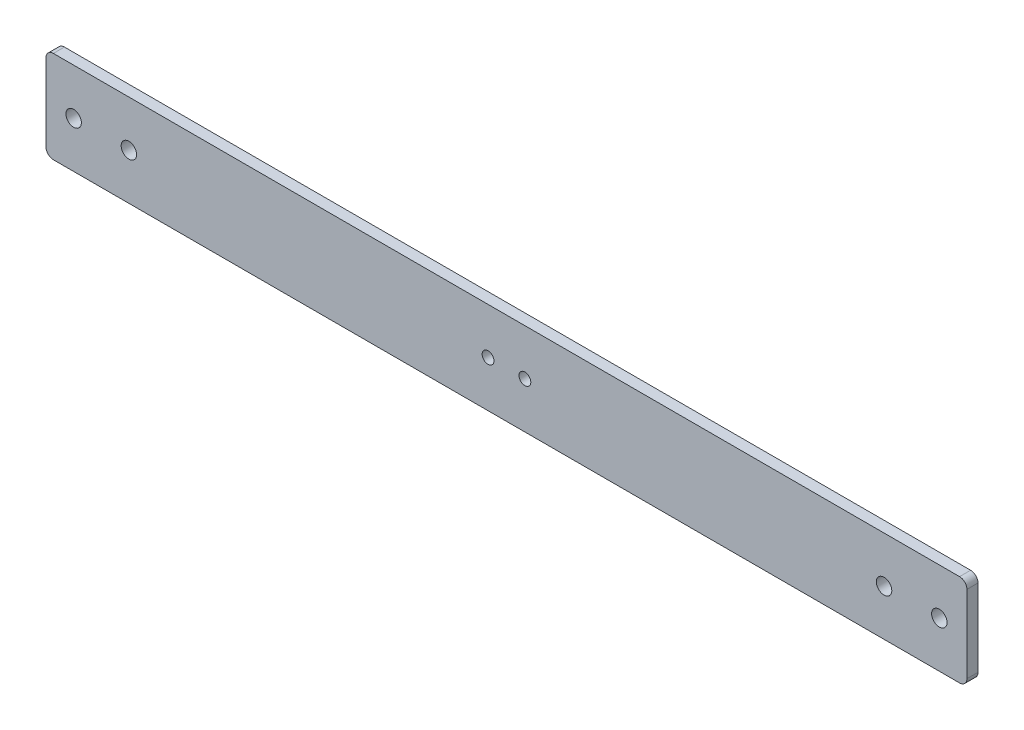
ISO-10303-21;
HEADER;
FILE_DESCRIPTION(('STEP AP214'),'2;1');
FILE_NAME('part.step','',(''),(''),'','','');
FILE_SCHEMA(('AUTOMOTIVE_DESIGN { 1 0 10303 214 1 1 1 1 }'));
ENDSEC;
DATA;
#1=APPLICATION_CONTEXT('core data for automotive mechanical design processes');
#2=APPLICATION_PROTOCOL_DEFINITION('international standard','automotive_design',2000,#1);
#3=PRODUCT_CONTEXT('',#1,'mechanical');
#4=PRODUCT('Part','Part','',(#3));
#5=PRODUCT_RELATED_PRODUCT_CATEGORY('part','',(#4));
#6=PRODUCT_DEFINITION_FORMATION('','',#4);
#7=PRODUCT_DEFINITION_CONTEXT('part definition',#1,'design');
#8=PRODUCT_DEFINITION('design','',#6,#7);
#9=PRODUCT_DEFINITION_SHAPE('','',#8);
#10=(LENGTH_UNIT() NAMED_UNIT(*) SI_UNIT(.MILLI.,.METRE.));
#11=(NAMED_UNIT(*) PLANE_ANGLE_UNIT() SI_UNIT($,.RADIAN.));
#12=(NAMED_UNIT(*) SI_UNIT($,.STERADIAN.) SOLID_ANGLE_UNIT());
#13=UNCERTAINTY_MEASURE_WITH_UNIT(LENGTH_MEASURE(1.E-05),#10,'distance_accuracy_value','');
#14=(GEOMETRIC_REPRESENTATION_CONTEXT(3) GLOBAL_UNCERTAINTY_ASSIGNED_CONTEXT((#13)) GLOBAL_UNIT_ASSIGNED_CONTEXT((#10,
#11,#12)) REPRESENTATION_CONTEXT('',''));
#15=CARTESIAN_POINT('',(0.,0.,0.));
#16=DIRECTION('',(0.,0.,1.));
#17=DIRECTION('',(1.,0.,0.));
#18=AXIS2_PLACEMENT_3D('',#15,#16,#17);
#19=CARTESIAN_POINT('',(125.,-12.5,3.));
#20=DIRECTION('',(-1.,0.,0.));
#21=DIRECTION('',(0.,0.,1.));
#22=AXIS2_PLACEMENT_3D('',#19,#20,#21);
#23=PLANE('',#22);
#24=DIRECTION('',(0.,1.,0.));
#25=VECTOR('',#24,1.);
#26=CARTESIAN_POINT('',(125.,-12.5,3.));
#27=LINE('',#26,#25);
#28=CARTESIAN_POINT('',(125.,-10.5,3.));
#29=VERTEX_POINT('',#28);
#30=CARTESIAN_POINT('',(125.,10.5,3.));
#31=VERTEX_POINT('',#30);
#32=EDGE_CURVE('E127',#29,#31,#27,.T.);
#33=ORIENTED_EDGE('',*,*,#32,.F.);
#34=DIRECTION('',(0.,0.,-1.));
#35=VECTOR('',#34,1.);
#36=CARTESIAN_POINT('',(125.,-10.5,3.));
#37=LINE('',#36,#35);
#38=CARTESIAN_POINT('',(125.,-10.5,0.));
#39=VERTEX_POINT('',#38);
#40=EDGE_CURVE('E112',#29,#39,#37,.T.);
#41=ORIENTED_EDGE('',*,*,#40,.T.);
#42=DIRECTION('',(0.,1.,0.));
#43=VECTOR('',#42,1.);
#44=CARTESIAN_POINT('',(125.,-12.5,0.));
#45=LINE('',#44,#43);
#46=CARTESIAN_POINT('',(125.,10.5,0.));
#47=VERTEX_POINT('',#46);
#48=EDGE_CURVE('E124',#39,#47,#45,.T.);
#49=ORIENTED_EDGE('',*,*,#48,.T.);
#50=DIRECTION('',(0.,0.,-1.));
#51=VECTOR('',#50,1.);
#52=CARTESIAN_POINT('',(125.,10.5,3.));
#53=LINE('',#52,#51);
#54=EDGE_CURVE('E129',#47,#31,#53,.F.);
#55=ORIENTED_EDGE('',*,*,#54,.T.);
#56=EDGE_LOOP('',(#33,#41,#49,#55));
#57=FACE_BOUND('',#56,.T.);
#58=ADVANCED_FACE('F43',(#57),#23,.F.);
#59=CARTESIAN_POINT('',(-125.,12.5,3.));
#60=DIRECTION('',(0.,-1.,0.));
#61=DIRECTION('',(0.,0.,-1.));
#62=AXIS2_PLACEMENT_3D('',#59,#60,#61);
#63=PLANE('',#62);
#64=DIRECTION('',(-1.,0.,0.));
#65=VECTOR('',#64,1.);
#66=CARTESIAN_POINT('',(-125.,12.5,3.));
#67=LINE('',#66,#65);
#68=CARTESIAN_POINT('',(123.,12.5,3.));
#69=VERTEX_POINT('',#68);
#70=CARTESIAN_POINT('',(-123.,12.5,3.));
#71=VERTEX_POINT('',#70);
#72=EDGE_CURVE('E182',#69,#71,#67,.T.);
#73=ORIENTED_EDGE('',*,*,#72,.F.);
#74=DIRECTION('',(0.,0.,-1.));
#75=VECTOR('',#74,1.);
#76=CARTESIAN_POINT('',(123.,12.5,3.));
#77=LINE('',#76,#75);
#78=CARTESIAN_POINT('',(123.,12.5,0.));
#79=VERTEX_POINT('',#78);
#80=EDGE_CURVE('E166',#69,#79,#77,.T.);
#81=ORIENTED_EDGE('',*,*,#80,.T.);
#82=DIRECTION('',(-1.,0.,0.));
#83=VECTOR('',#82,1.);
#84=CARTESIAN_POINT('',(-125.,12.5,0.));
#85=LINE('',#84,#83);
#86=CARTESIAN_POINT('',(-123.,12.5,0.));
#87=VERTEX_POINT('',#86);
#88=EDGE_CURVE('E133',#79,#87,#85,.T.);
#89=ORIENTED_EDGE('',*,*,#88,.T.);
#90=DIRECTION('',(0.,0.,-1.));
#91=VECTOR('',#90,1.);
#92=CARTESIAN_POINT('',(-123.,12.5,3.));
#93=LINE('',#92,#91);
#94=EDGE_CURVE('E164',#87,#71,#93,.F.);
#95=ORIENTED_EDGE('',*,*,#94,.T.);
#96=EDGE_LOOP('',(#73,#81,#89,#95));
#97=FACE_BOUND('',#96,.T.);
#98=ADVANCED_FACE('F252',(#97),#63,.F.);
#99=CARTESIAN_POINT('',(-125.,-12.5,3.));
#100=DIRECTION('',(1.,0.,0.));
#101=DIRECTION('',(0.,0.,-1.));
#102=AXIS2_PLACEMENT_3D('',#99,#100,#101);
#103=PLANE('',#102);
#104=DIRECTION('',(0.,-1.,0.));
#105=VECTOR('',#104,1.);
#106=CARTESIAN_POINT('',(-125.,-12.5,0.));
#107=LINE('',#106,#105);
#108=CARTESIAN_POINT('',(-125.,10.5,0.));
#109=VERTEX_POINT('',#108);
#110=CARTESIAN_POINT('',(-125.,-10.5,0.));
#111=VERTEX_POINT('',#110);
#112=EDGE_CURVE('E137',#109,#111,#107,.T.);
#113=ORIENTED_EDGE('',*,*,#112,.T.);
#114=DIRECTION('',(0.,0.,-1.));
#115=VECTOR('',#114,1.);
#116=CARTESIAN_POINT('',(-125.,-10.5,3.));
#117=LINE('',#116,#115);
#118=CARTESIAN_POINT('',(-125.,-10.5,3.));
#119=VERTEX_POINT('',#118);
#120=EDGE_CURVE('E11',#111,#119,#117,.F.);
#121=ORIENTED_EDGE('',*,*,#120,.T.);
#122=DIRECTION('',(0.,-1.,0.));
#123=VECTOR('',#122,1.);
#124=CARTESIAN_POINT('',(-125.,-12.5,3.));
#125=LINE('',#124,#123);
#126=CARTESIAN_POINT('',(-125.,10.5,3.));
#127=VERTEX_POINT('',#126);
#128=EDGE_CURVE('E172',#127,#119,#125,.T.);
#129=ORIENTED_EDGE('',*,*,#128,.F.);
#130=DIRECTION('',(0.,0.,-1.));
#131=VECTOR('',#130,1.);
#132=CARTESIAN_POINT('',(-125.,10.5,3.));
#133=LINE('',#132,#131);
#134=EDGE_CURVE('E51',#127,#109,#133,.T.);
#135=ORIENTED_EDGE('',*,*,#134,.T.);
#136=EDGE_LOOP('',(#113,#121,#129,#135));
#137=FACE_BOUND('',#136,.T.);
#138=ADVANCED_FACE('F171',(#137),#103,.F.);
#139=CARTESIAN_POINT('',(-125.,-12.5,3.));
#140=DIRECTION('',(0.,1.,0.));
#141=DIRECTION('',(0.,0.,1.));
#142=AXIS2_PLACEMENT_3D('',#139,#140,#141);
#143=PLANE('',#142);
#144=DIRECTION('',(1.,0.,0.));
#145=VECTOR('',#144,1.);
#146=CARTESIAN_POINT('',(-125.,-12.5,0.));
#147=LINE('',#146,#145);
#148=CARTESIAN_POINT('',(-123.,-12.5,0.));
#149=VERTEX_POINT('',#148);
#150=CARTESIAN_POINT('',(123.,-12.5,0.));
#151=VERTEX_POINT('',#150);
#152=EDGE_CURVE('E147',#149,#151,#147,.T.);
#153=ORIENTED_EDGE('',*,*,#152,.T.);
#154=DIRECTION('',(0.,0.,-1.));
#155=VECTOR('',#154,1.);
#156=CARTESIAN_POINT('',(123.,-12.5,3.));
#157=LINE('',#156,#155);
#158=CARTESIAN_POINT('',(123.,-12.5,3.));
#159=VERTEX_POINT('',#158);
#160=EDGE_CURVE('E113',#151,#159,#157,.F.);
#161=ORIENTED_EDGE('',*,*,#160,.T.);
#162=DIRECTION('',(1.,0.,0.));
#163=VECTOR('',#162,1.);
#164=CARTESIAN_POINT('',(-125.,-12.5,3.));
#165=LINE('',#164,#163);
#166=CARTESIAN_POINT('',(-123.,-12.5,3.));
#167=VERTEX_POINT('',#166);
#168=EDGE_CURVE('E143',#167,#159,#165,.T.);
#169=ORIENTED_EDGE('',*,*,#168,.F.);
#170=DIRECTION('',(0.,0.,-1.));
#171=VECTOR('',#170,1.);
#172=CARTESIAN_POINT('',(-123.,-12.5,3.));
#173=LINE('',#172,#171);
#174=EDGE_CURVE('E118',#167,#149,#173,.T.);
#175=ORIENTED_EDGE('',*,*,#174,.T.);
#176=EDGE_LOOP('',(#153,#161,#169,#175));
#177=FACE_BOUND('',#176,.T.);
#178=ADVANCED_FACE('F180',(#177),#143,.F.);
#179=CARTESIAN_POINT('',(0.,0.,3.));
#180=DIRECTION('',(0.,0.,-1.));
#181=DIRECTION('',(-1.,0.,0.));
#182=AXIS2_PLACEMENT_3D('',#179,#180,#181);
#183=PLANE('',#182);
#184=CARTESIAN_POINT('',(-117.5,0.,3.));
#185=DIRECTION('',(0.,0.,1.));
#186=DIRECTION('',(1.,0.,0.));
#187=AXIS2_PLACEMENT_3D('',#184,#185,#186);
#188=CIRCLE('',#187,2.1);
#189=CARTESIAN_POINT('',(-115.4,0.,3.));
#190=VERTEX_POINT('',#189);
#191=EDGE_CURVE('E140',#190,#190,#188,.T.);
#192=ORIENTED_EDGE('',*,*,#191,.F.);
#193=EDGE_LOOP('',(#192));
#194=FACE_BOUND('',#193,.T.);
#195=CARTESIAN_POINT('',(5.,0.,3.));
#196=DIRECTION('',(0.,0.,1.));
#197=DIRECTION('',(-1.,0.,0.));
#198=AXIS2_PLACEMENT_3D('',#195,#196,#197);
#199=CIRCLE('',#198,1.6);
#200=CARTESIAN_POINT('',(3.4,0.,3.));
#201=VERTEX_POINT('',#200);
#202=EDGE_CURVE('E211',#201,#201,#199,.T.);
#203=ORIENTED_EDGE('',*,*,#202,.F.);
#204=EDGE_LOOP('',(#203));
#205=FACE_BOUND('',#204,.T.);
#206=CARTESIAN_POINT('',(-102.5,0.,3.));
#207=DIRECTION('',(0.,0.,1.));
#208=DIRECTION('',(1.,0.,0.));
#209=AXIS2_PLACEMENT_3D('',#206,#207,#208);
#210=CIRCLE('',#209,2.1);
#211=CARTESIAN_POINT('',(-100.4,0.,3.));
#212=VERTEX_POINT('',#211);
#213=EDGE_CURVE('E193',#212,#212,#210,.T.);
#214=ORIENTED_EDGE('',*,*,#213,.F.);
#215=EDGE_LOOP('',(#214));
#216=FACE_BOUND('',#215,.T.);
#217=CARTESIAN_POINT('',(102.5,0.,3.));
#218=DIRECTION('',(0.,0.,1.));
#219=DIRECTION('',(-1.,0.,0.));
#220=AXIS2_PLACEMENT_3D('',#217,#218,#219);
#221=CIRCLE('',#220,2.1);
#222=CARTESIAN_POINT('',(100.4,0.,3.));
#223=VERTEX_POINT('',#222);
#224=EDGE_CURVE('E186',#223,#223,#221,.T.);
#225=ORIENTED_EDGE('',*,*,#224,.F.);
#226=EDGE_LOOP('',(#225));
#227=FACE_BOUND('',#226,.T.);
#228=CARTESIAN_POINT('',(117.5,0.,3.));
#229=DIRECTION('',(0.,0.,1.));
#230=DIRECTION('',(-1.,0.,0.));
#231=AXIS2_PLACEMENT_3D('',#228,#229,#230);
#232=CIRCLE('',#231,2.1);
#233=CARTESIAN_POINT('',(115.4,0.,3.));
#234=VERTEX_POINT('',#233);
#235=EDGE_CURVE('E206',#234,#234,#232,.T.);
#236=ORIENTED_EDGE('',*,*,#235,.F.);
#237=EDGE_LOOP('',(#236));
#238=FACE_BOUND('',#237,.T.);
#239=CARTESIAN_POINT('',(-5.,0.,3.));
#240=DIRECTION('',(0.,0.,1.));
#241=DIRECTION('',(1.,0.,0.));
#242=AXIS2_PLACEMENT_3D('',#239,#240,#241);
#243=CIRCLE('',#242,1.6);
#244=CARTESIAN_POINT('',(-3.4,0.,3.));
#245=VERTEX_POINT('',#244);
#246=EDGE_CURVE('E199',#245,#245,#243,.T.);
#247=ORIENTED_EDGE('',*,*,#246,.F.);
#248=EDGE_LOOP('',(#247));
#249=FACE_BOUND('',#248,.T.);
#250=ORIENTED_EDGE('',*,*,#168,.T.);
#251=CARTESIAN_POINT('',(123.,-10.5,3.));
#252=DIRECTION('',(0.,0.,-1.));
#253=DIRECTION('',(-1.,0.,0.));
#254=AXIS2_PLACEMENT_3D('',#251,#252,#253);
#255=CIRCLE('',#254,2.);
#256=EDGE_CURVE('E162',#159,#29,#255,.F.);
#257=ORIENTED_EDGE('',*,*,#256,.T.);
#258=ORIENTED_EDGE('',*,*,#32,.T.);
#259=CARTESIAN_POINT('',(123.,10.5,3.));
#260=DIRECTION('',(0.,0.,-1.));
#261=DIRECTION('',(-1.,0.,0.));
#262=AXIS2_PLACEMENT_3D('',#259,#260,#261);
#263=CIRCLE('',#262,2.);
#264=EDGE_CURVE('E160',#31,#69,#263,.F.);
#265=ORIENTED_EDGE('',*,*,#264,.T.);
#266=ORIENTED_EDGE('',*,*,#72,.T.);
#267=CARTESIAN_POINT('',(-123.,10.5,3.));
#268=DIRECTION('',(0.,0.,-1.));
#269=DIRECTION('',(-1.,0.,0.));
#270=AXIS2_PLACEMENT_3D('',#267,#268,#269);
#271=CIRCLE('',#270,2.);
#272=EDGE_CURVE('E63',#71,#127,#271,.F.);
#273=ORIENTED_EDGE('',*,*,#272,.T.);
#274=ORIENTED_EDGE('',*,*,#128,.T.);
#275=CARTESIAN_POINT('',(-123.,-10.5,3.));
#276=DIRECTION('',(0.,0.,-1.));
#277=DIRECTION('',(-1.,0.,0.));
#278=AXIS2_PLACEMENT_3D('',#275,#276,#277);
#279=CIRCLE('',#278,2.);
#280=EDGE_CURVE('E158',#119,#167,#279,.F.);
#281=ORIENTED_EDGE('',*,*,#280,.T.);
#282=EDGE_LOOP('',(#250,#257,#258,#265,#266,#273,#274,#281));
#283=FACE_BOUND('',#282,.T.);
#284=ADVANCED_FACE('F221',(#194,#205,#216,#227,#238,#249,#283),#183,.F.);
#285=CARTESIAN_POINT('',(0.,0.,0.));
#286=DIRECTION('',(0.,0.,-1.));
#287=DIRECTION('',(-1.,0.,0.));
#288=AXIS2_PLACEMENT_3D('',#285,#286,#287);
#289=PLANE('',#288);
#290=CARTESIAN_POINT('',(-117.5,0.,0.));
#291=DIRECTION('',(0.,0.,1.));
#292=DIRECTION('',(1.,0.,0.));
#293=AXIS2_PLACEMENT_3D('',#290,#291,#292);
#294=CIRCLE('',#293,2.1);
#295=CARTESIAN_POINT('',(-115.4,0.,0.));
#296=VERTEX_POINT('',#295);
#297=EDGE_CURVE('E134',#296,#296,#294,.T.);
#298=ORIENTED_EDGE('',*,*,#297,.T.);
#299=EDGE_LOOP('',(#298));
#300=FACE_BOUND('',#299,.T.);
#301=CARTESIAN_POINT('',(5.,0.,0.));
#302=DIRECTION('',(0.,0.,1.));
#303=DIRECTION('',(-1.,0.,0.));
#304=AXIS2_PLACEMENT_3D('',#301,#302,#303);
#305=CIRCLE('',#304,1.6);
#306=CARTESIAN_POINT('',(3.4,0.,0.));
#307=VERTEX_POINT('',#306);
#308=EDGE_CURVE('E203',#307,#307,#305,.T.);
#309=ORIENTED_EDGE('',*,*,#308,.T.);
#310=EDGE_LOOP('',(#309));
#311=FACE_BOUND('',#310,.T.);
#312=CARTESIAN_POINT('',(-102.5,0.,0.));
#313=DIRECTION('',(0.,0.,1.));
#314=DIRECTION('',(1.,0.,0.));
#315=AXIS2_PLACEMENT_3D('',#312,#313,#314);
#316=CIRCLE('',#315,2.1);
#317=CARTESIAN_POINT('',(-100.4,0.,0.));
#318=VERTEX_POINT('',#317);
#319=EDGE_CURVE('E196',#318,#318,#316,.T.);
#320=ORIENTED_EDGE('',*,*,#319,.T.);
#321=EDGE_LOOP('',(#320));
#322=FACE_BOUND('',#321,.T.);
#323=CARTESIAN_POINT('',(102.5,0.,0.));
#324=DIRECTION('',(0.,0.,1.));
#325=DIRECTION('',(-1.,0.,0.));
#326=AXIS2_PLACEMENT_3D('',#323,#324,#325);
#327=CIRCLE('',#326,2.1);
#328=CARTESIAN_POINT('',(100.4,0.,0.));
#329=VERTEX_POINT('',#328);
#330=EDGE_CURVE('E189',#329,#329,#327,.T.);
#331=ORIENTED_EDGE('',*,*,#330,.T.);
#332=EDGE_LOOP('',(#331));
#333=FACE_BOUND('',#332,.T.);
#334=CARTESIAN_POINT('',(117.5,0.,0.));
#335=DIRECTION('',(0.,0.,1.));
#336=DIRECTION('',(-1.,0.,0.));
#337=AXIS2_PLACEMENT_3D('',#334,#335,#336);
#338=CIRCLE('',#337,2.1);
#339=CARTESIAN_POINT('',(115.4,0.,0.));
#340=VERTEX_POINT('',#339);
#341=EDGE_CURVE('E190',#340,#340,#338,.T.);
#342=ORIENTED_EDGE('',*,*,#341,.T.);
#343=EDGE_LOOP('',(#342));
#344=FACE_BOUND('',#343,.T.);
#345=CARTESIAN_POINT('',(-5.,0.,0.));
#346=DIRECTION('',(0.,0.,1.));
#347=DIRECTION('',(1.,0.,0.));
#348=AXIS2_PLACEMENT_3D('',#345,#346,#347);
#349=CIRCLE('',#348,1.6);
#350=CARTESIAN_POINT('',(-3.4,0.,0.));
#351=VERTEX_POINT('',#350);
#352=EDGE_CURVE('E202',#351,#351,#349,.T.);
#353=ORIENTED_EDGE('',*,*,#352,.T.);
#354=EDGE_LOOP('',(#353));
#355=FACE_BOUND('',#354,.T.);
#356=ORIENTED_EDGE('',*,*,#48,.F.);
#357=CARTESIAN_POINT('',(123.,-10.5,0.));
#358=DIRECTION('',(0.,0.,-1.));
#359=DIRECTION('',(-1.,0.,0.));
#360=AXIS2_PLACEMENT_3D('',#357,#358,#359);
#361=CIRCLE('',#360,2.);
#362=EDGE_CURVE('E108',#39,#151,#361,.T.);
#363=ORIENTED_EDGE('',*,*,#362,.T.);
#364=ORIENTED_EDGE('',*,*,#152,.F.);
#365=CARTESIAN_POINT('',(-123.,-10.5,0.));
#366=DIRECTION('',(0.,0.,-1.));
#367=DIRECTION('',(-1.,0.,0.));
#368=AXIS2_PLACEMENT_3D('',#365,#366,#367);
#369=CIRCLE('',#368,2.);
#370=EDGE_CURVE('E151',#149,#111,#369,.T.);
#371=ORIENTED_EDGE('',*,*,#370,.T.);
#372=ORIENTED_EDGE('',*,*,#112,.F.);
#373=CARTESIAN_POINT('',(-123.,10.5,0.));
#374=DIRECTION('',(0.,0.,-1.));
#375=DIRECTION('',(-1.,0.,0.));
#376=AXIS2_PLACEMENT_3D('',#373,#374,#375);
#377=CIRCLE('',#376,2.);
#378=EDGE_CURVE('E128',#109,#87,#377,.T.);
#379=ORIENTED_EDGE('',*,*,#378,.T.);
#380=ORIENTED_EDGE('',*,*,#88,.F.);
#381=CARTESIAN_POINT('',(123.,10.5,0.));
#382=DIRECTION('',(0.,0.,-1.));
#383=DIRECTION('',(-1.,0.,0.));
#384=AXIS2_PLACEMENT_3D('',#381,#382,#383);
#385=CIRCLE('',#384,2.);
#386=EDGE_CURVE('E119',#79,#47,#385,.T.);
#387=ORIENTED_EDGE('',*,*,#386,.T.);
#388=EDGE_LOOP('',(#356,#363,#364,#371,#372,#379,#380,#387));
#389=FACE_BOUND('',#388,.T.);
#390=ADVANCED_FACE('F131',(#300,#311,#322,#333,#344,#355,#389),#289,.T.);
#391=CARTESIAN_POINT('',(-5.,0.,0.));
#392=DIRECTION('',(0.,0.,1.));
#393=DIRECTION('',(1.,0.,0.));
#394=AXIS2_PLACEMENT_3D('',#391,#392,#393);
#395=CYLINDRICAL_SURFACE('',#394,1.6);
#396=ORIENTED_EDGE('',*,*,#352,.F.);
#397=EDGE_LOOP('',(#396));
#398=FACE_BOUND('',#397,.T.);
#399=ORIENTED_EDGE('',*,*,#246,.T.);
#400=EDGE_LOOP('',(#399));
#401=FACE_BOUND('',#400,.T.);
#402=ADVANCED_FACE('F235',(#398,#401),#395,.F.);
#403=CARTESIAN_POINT('',(117.5,0.,0.));
#404=DIRECTION('',(0.,0.,1.));
#405=DIRECTION('',(1.,0.,0.));
#406=AXIS2_PLACEMENT_3D('',#403,#404,#405);
#407=CYLINDRICAL_SURFACE('',#406,2.1);
#408=ORIENTED_EDGE('',*,*,#341,.F.);
#409=EDGE_LOOP('',(#408));
#410=FACE_BOUND('',#409,.T.);
#411=ORIENTED_EDGE('',*,*,#235,.T.);
#412=EDGE_LOOP('',(#411));
#413=FACE_BOUND('',#412,.T.);
#414=ADVANCED_FACE('F237',(#410,#413),#407,.F.);
#415=CARTESIAN_POINT('',(102.5,0.,0.));
#416=DIRECTION('',(0.,0.,1.));
#417=DIRECTION('',(1.,0.,0.));
#418=AXIS2_PLACEMENT_3D('',#415,#416,#417);
#419=CYLINDRICAL_SURFACE('',#418,2.1);
#420=ORIENTED_EDGE('',*,*,#330,.F.);
#421=EDGE_LOOP('',(#420));
#422=FACE_BOUND('',#421,.T.);
#423=ORIENTED_EDGE('',*,*,#224,.T.);
#424=EDGE_LOOP('',(#423));
#425=FACE_BOUND('',#424,.T.);
#426=ADVANCED_FACE('F243',(#422,#425),#419,.F.);
#427=CARTESIAN_POINT('',(-102.5,0.,0.));
#428=DIRECTION('',(0.,0.,1.));
#429=DIRECTION('',(1.,0.,0.));
#430=AXIS2_PLACEMENT_3D('',#427,#428,#429);
#431=CYLINDRICAL_SURFACE('',#430,2.1);
#432=ORIENTED_EDGE('',*,*,#319,.F.);
#433=EDGE_LOOP('',(#432));
#434=FACE_BOUND('',#433,.T.);
#435=ORIENTED_EDGE('',*,*,#213,.T.);
#436=EDGE_LOOP('',(#435));
#437=FACE_BOUND('',#436,.T.);
#438=ADVANCED_FACE('F312',(#434,#437),#431,.F.);
#439=CARTESIAN_POINT('',(5.,0.,0.));
#440=DIRECTION('',(0.,0.,1.));
#441=DIRECTION('',(1.,0.,0.));
#442=AXIS2_PLACEMENT_3D('',#439,#440,#441);
#443=CYLINDRICAL_SURFACE('',#442,1.6);
#444=ORIENTED_EDGE('',*,*,#308,.F.);
#445=EDGE_LOOP('',(#444));
#446=FACE_BOUND('',#445,.T.);
#447=ORIENTED_EDGE('',*,*,#202,.T.);
#448=EDGE_LOOP('',(#447));
#449=FACE_BOUND('',#448,.T.);
#450=ADVANCED_FACE('F302',(#446,#449),#443,.F.);
#451=CARTESIAN_POINT('',(-117.5,0.,0.));
#452=DIRECTION('',(0.,0.,1.));
#453=DIRECTION('',(1.,0.,0.));
#454=AXIS2_PLACEMENT_3D('',#451,#452,#453);
#455=CYLINDRICAL_SURFACE('',#454,2.1);
#456=ORIENTED_EDGE('',*,*,#297,.F.);
#457=EDGE_LOOP('',(#456));
#458=FACE_BOUND('',#457,.T.);
#459=ORIENTED_EDGE('',*,*,#191,.T.);
#460=EDGE_LOOP('',(#459));
#461=FACE_BOUND('',#460,.T.);
#462=ADVANCED_FACE('F219',(#458,#461),#455,.F.);
#463=CARTESIAN_POINT('',(123.,-10.5,3.));
#464=DIRECTION('',(0.,0.,-1.));
#465=DIRECTION('',(-1.,0.,0.));
#466=AXIS2_PLACEMENT_3D('',#463,#464,#465);
#467=CYLINDRICAL_SURFACE('',#466,2.);
#468=ORIENTED_EDGE('',*,*,#256,.F.);
#469=ORIENTED_EDGE('',*,*,#160,.F.);
#470=ORIENTED_EDGE('',*,*,#362,.F.);
#471=ORIENTED_EDGE('',*,*,#40,.F.);
#472=EDGE_LOOP('',(#468,#469,#470,#471));
#473=FACE_BOUND('',#472,.T.);
#474=ADVANCED_FACE('F111',(#473),#467,.T.);
#475=CARTESIAN_POINT('',(123.,10.5,3.));
#476=DIRECTION('',(0.,0.,-1.));
#477=DIRECTION('',(-1.,0.,0.));
#478=AXIS2_PLACEMENT_3D('',#475,#476,#477);
#479=CYLINDRICAL_SURFACE('',#478,2.);
#480=ORIENTED_EDGE('',*,*,#264,.F.);
#481=ORIENTED_EDGE('',*,*,#54,.F.);
#482=ORIENTED_EDGE('',*,*,#386,.F.);
#483=ORIENTED_EDGE('',*,*,#80,.F.);
#484=EDGE_LOOP('',(#480,#481,#482,#483));
#485=FACE_BOUND('',#484,.T.);
#486=ADVANCED_FACE('F264',(#485),#479,.T.);
#487=CARTESIAN_POINT('',(-123.,-10.5,3.));
#488=DIRECTION('',(0.,0.,-1.));
#489=DIRECTION('',(-1.,0.,0.));
#490=AXIS2_PLACEMENT_3D('',#487,#488,#489);
#491=CYLINDRICAL_SURFACE('',#490,2.);
#492=ORIENTED_EDGE('',*,*,#280,.F.);
#493=ORIENTED_EDGE('',*,*,#120,.F.);
#494=ORIENTED_EDGE('',*,*,#370,.F.);
#495=ORIENTED_EDGE('',*,*,#174,.F.);
#496=EDGE_LOOP('',(#492,#493,#494,#495));
#497=FACE_BOUND('',#496,.T.);
#498=ADVANCED_FACE('F177',(#497),#491,.T.);
#499=CARTESIAN_POINT('',(-123.,10.5,3.));
#500=DIRECTION('',(0.,0.,-1.));
#501=DIRECTION('',(-1.,0.,0.));
#502=AXIS2_PLACEMENT_3D('',#499,#500,#501);
#503=CYLINDRICAL_SURFACE('',#502,2.);
#504=ORIENTED_EDGE('',*,*,#272,.F.);
#505=ORIENTED_EDGE('',*,*,#94,.F.);
#506=ORIENTED_EDGE('',*,*,#378,.F.);
#507=ORIENTED_EDGE('',*,*,#134,.F.);
#508=EDGE_LOOP('',(#504,#505,#506,#507));
#509=FACE_BOUND('',#508,.T.);
#510=ADVANCED_FACE('F45',(#509),#503,.T.);
#511=CLOSED_SHELL('',(#58,#98,#138,#178,#284,#390,#402,#414,#426,#438,#450,#462,#474,#486,#498,#510));
#512=MANIFOLD_SOLID_BREP('B2',#511);
#513=ADVANCED_BREP_SHAPE_REPRESENTATION('',(#18,#512),#14);
#514=SHAPE_DEFINITION_REPRESENTATION(#9,#513);
ENDSEC;
END-ISO-10303-21;
